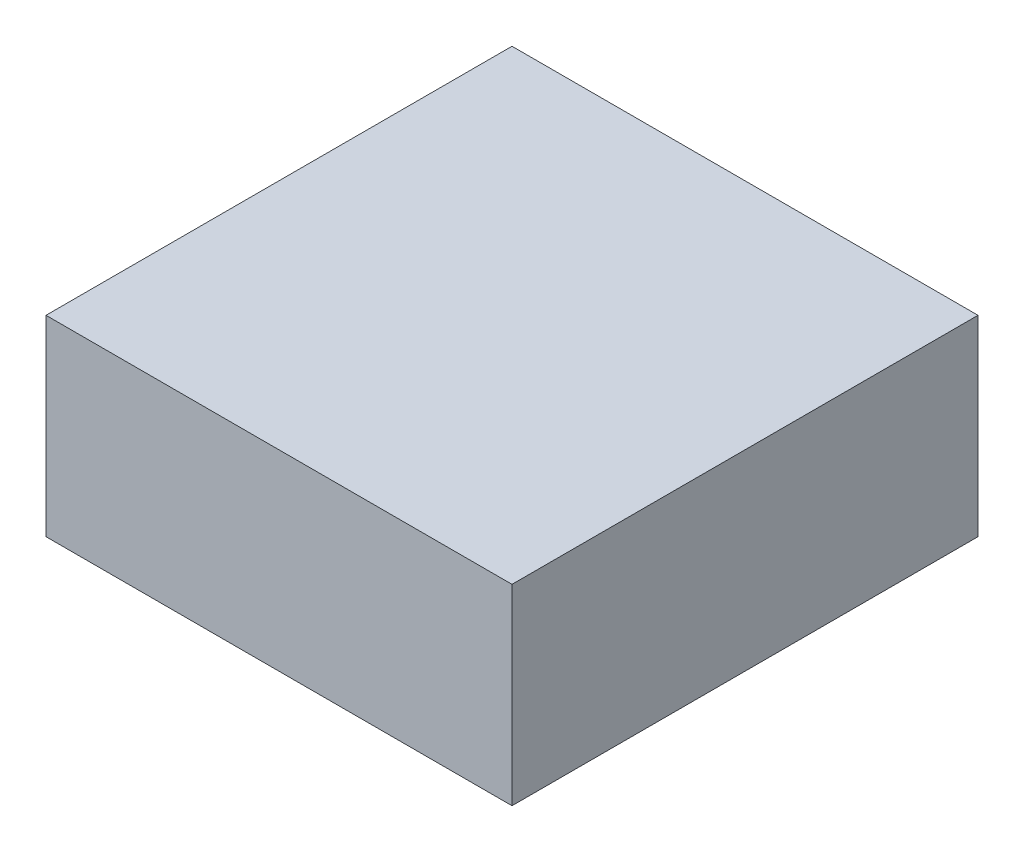
ISO-10303-21;
HEADER;
FILE_DESCRIPTION(('STEP AP214'),'2;1');
FILE_NAME('part.step','',(''),(''),'','','');
FILE_SCHEMA(('AUTOMOTIVE_DESIGN { 1 0 10303 214 1 1 1 1 }'));
ENDSEC;
DATA;
#1=APPLICATION_CONTEXT('core data for automotive mechanical design processes');
#2=APPLICATION_PROTOCOL_DEFINITION('international standard','automotive_design',2000,#1);
#3=PRODUCT_CONTEXT('',#1,'mechanical');
#4=PRODUCT('Part','Part','',(#3));
#5=PRODUCT_RELATED_PRODUCT_CATEGORY('part','',(#4));
#6=PRODUCT_DEFINITION_FORMATION('','',#4);
#7=PRODUCT_DEFINITION_CONTEXT('part definition',#1,'design');
#8=PRODUCT_DEFINITION('design','',#6,#7);
#9=PRODUCT_DEFINITION_SHAPE('','',#8);
#10=(LENGTH_UNIT() NAMED_UNIT(*) SI_UNIT(.MILLI.,.METRE.));
#11=(NAMED_UNIT(*) PLANE_ANGLE_UNIT() SI_UNIT($,.RADIAN.));
#12=(NAMED_UNIT(*) SI_UNIT($,.STERADIAN.) SOLID_ANGLE_UNIT());
#13=UNCERTAINTY_MEASURE_WITH_UNIT(LENGTH_MEASURE(1.E-05),#10,'distance_accuracy_value','');
#14=(GEOMETRIC_REPRESENTATION_CONTEXT(3) GLOBAL_UNCERTAINTY_ASSIGNED_CONTEXT((#13)) GLOBAL_UNIT_ASSIGNED_CONTEXT((#10,
#11,#12)) REPRESENTATION_CONTEXT('',''));
#15=CARTESIAN_POINT('',(0.,0.,0.));
#16=DIRECTION('',(0.,0.,1.));
#17=DIRECTION('',(1.,0.,0.));
#18=AXIS2_PLACEMENT_3D('',#15,#16,#17);
#19=CARTESIAN_POINT('',(0.,0.465,0.));
#20=DIRECTION('',(1.,0.,0.));
#21=DIRECTION('',(0.,0.,-1.));
#22=AXIS2_PLACEMENT_3D('',#19,#20,#21);
#23=PLANE('',#22);
#24=DIRECTION('',(0.,0.,1.));
#25=VECTOR('',#24,1.);
#26=CARTESIAN_POINT('',(0.,0.,0.));
#27=LINE('',#26,#25);
#28=CARTESIAN_POINT('',(0.,0.,0.));
#29=VERTEX_POINT('',#28);
#30=CARTESIAN_POINT('',(0.,0.,1.13));
#31=VERTEX_POINT('',#30);
#32=EDGE_CURVE('E98',#29,#31,#27,.T.);
#33=ORIENTED_EDGE('',*,*,#32,.T.);
#34=DIRECTION('',(0.,-1.,0.));
#35=VECTOR('',#34,1.);
#36=CARTESIAN_POINT('',(0.,0.465,1.13));
#37=LINE('',#36,#35);
#38=CARTESIAN_POINT('',(0.,0.465,1.13));
#39=VERTEX_POINT('',#38);
#40=EDGE_CURVE('E11',#39,#31,#37,.T.);
#41=ORIENTED_EDGE('',*,*,#40,.F.);
#42=DIRECTION('',(0.,0.,1.));
#43=VECTOR('',#42,1.);
#44=CARTESIAN_POINT('',(0.,0.465,0.));
#45=LINE('',#44,#43);
#46=CARTESIAN_POINT('',(0.,0.465,0.));
#47=VERTEX_POINT('',#46);
#48=EDGE_CURVE('E86',#47,#39,#45,.T.);
#49=ORIENTED_EDGE('',*,*,#48,.F.);
#50=DIRECTION('',(0.,-1.,0.));
#51=VECTOR('',#50,1.);
#52=CARTESIAN_POINT('',(0.,0.465,0.));
#53=LINE('',#52,#51);
#54=EDGE_CURVE('E94',#47,#29,#53,.T.);
#55=ORIENTED_EDGE('',*,*,#54,.T.);
#56=EDGE_LOOP('',(#33,#41,#49,#55));
#57=FACE_BOUND('',#56,.T.);
#58=ADVANCED_FACE('F35',(#57),#23,.F.);
#59=CARTESIAN_POINT('',(0.,0.465,1.13));
#60=DIRECTION('',(0.,0.,-1.));
#61=DIRECTION('',(-1.,0.,0.));
#62=AXIS2_PLACEMENT_3D('',#59,#60,#61);
#63=PLANE('',#62);
#64=DIRECTION('',(1.,0.,0.));
#65=VECTOR('',#64,1.);
#66=CARTESIAN_POINT('',(0.,0.,1.13));
#67=LINE('',#66,#65);
#68=CARTESIAN_POINT('',(1.13,0.,1.13));
#69=VERTEX_POINT('',#68);
#70=EDGE_CURVE('E90',#31,#69,#67,.T.);
#71=ORIENTED_EDGE('',*,*,#70,.T.);
#72=DIRECTION('',(0.,-1.,0.));
#73=VECTOR('',#72,1.);
#74=CARTESIAN_POINT('',(1.13,0.465,1.13));
#75=LINE('',#74,#73);
#76=CARTESIAN_POINT('',(1.13,0.465,1.13));
#77=VERTEX_POINT('',#76);
#78=EDGE_CURVE('E43',#77,#69,#75,.T.);
#79=ORIENTED_EDGE('',*,*,#78,.F.);
#80=DIRECTION('',(1.,0.,0.));
#81=VECTOR('',#80,1.);
#82=CARTESIAN_POINT('',(0.,0.465,1.13));
#83=LINE('',#82,#81);
#84=EDGE_CURVE('E81',#39,#77,#83,.T.);
#85=ORIENTED_EDGE('',*,*,#84,.F.);
#86=ORIENTED_EDGE('',*,*,#40,.T.);
#87=EDGE_LOOP('',(#71,#79,#85,#86));
#88=FACE_BOUND('',#87,.T.);
#89=ADVANCED_FACE('F89',(#88),#63,.F.);
#90=CARTESIAN_POINT('',(1.13,0.465,0.));
#91=DIRECTION('',(-1.,0.,0.));
#92=DIRECTION('',(0.,0.,1.));
#93=AXIS2_PLACEMENT_3D('',#90,#91,#92);
#94=PLANE('',#93);
#95=DIRECTION('',(0.,0.,-1.));
#96=VECTOR('',#95,1.);
#97=CARTESIAN_POINT('',(1.13,0.,0.));
#98=LINE('',#97,#96);
#99=CARTESIAN_POINT('',(1.13,0.,0.));
#100=VERTEX_POINT('',#99);
#101=EDGE_CURVE('E68',#69,#100,#98,.T.);
#102=ORIENTED_EDGE('',*,*,#101,.T.);
#103=DIRECTION('',(0.,-1.,0.));
#104=VECTOR('',#103,1.);
#105=CARTESIAN_POINT('',(1.13,0.465,0.));
#106=LINE('',#105,#104);
#107=CARTESIAN_POINT('',(1.13,0.465,0.));
#108=VERTEX_POINT('',#107);
#109=EDGE_CURVE('E91',#108,#100,#106,.T.);
#110=ORIENTED_EDGE('',*,*,#109,.F.);
#111=DIRECTION('',(0.,0.,-1.));
#112=VECTOR('',#111,1.);
#113=CARTESIAN_POINT('',(1.13,0.465,0.));
#114=LINE('',#113,#112);
#115=EDGE_CURVE('E84',#77,#108,#114,.T.);
#116=ORIENTED_EDGE('',*,*,#115,.F.);
#117=ORIENTED_EDGE('',*,*,#78,.T.);
#118=EDGE_LOOP('',(#102,#110,#116,#117));
#119=FACE_BOUND('',#118,.T.);
#120=ADVANCED_FACE('F92',(#119),#94,.F.);
#121=CARTESIAN_POINT('',(0.,0.465,0.));
#122=DIRECTION('',(0.,0.,1.));
#123=DIRECTION('',(1.,0.,0.));
#124=AXIS2_PLACEMENT_3D('',#121,#122,#123);
#125=PLANE('',#124);
#126=DIRECTION('',(-1.,0.,0.));
#127=VECTOR('',#126,1.);
#128=CARTESIAN_POINT('',(0.,0.,0.));
#129=LINE('',#128,#127);
#130=EDGE_CURVE('E74',#100,#29,#129,.T.);
#131=ORIENTED_EDGE('',*,*,#130,.T.);
#132=ORIENTED_EDGE('',*,*,#54,.F.);
#133=DIRECTION('',(-1.,0.,0.));
#134=VECTOR('',#133,1.);
#135=CARTESIAN_POINT('',(0.,0.465,0.));
#136=LINE('',#135,#134);
#137=EDGE_CURVE('E51',#108,#47,#136,.T.);
#138=ORIENTED_EDGE('',*,*,#137,.F.);
#139=ORIENTED_EDGE('',*,*,#109,.T.);
#140=EDGE_LOOP('',(#131,#132,#138,#139));
#141=FACE_BOUND('',#140,.T.);
#142=ADVANCED_FACE('F105',(#141),#125,.F.);
#143=CARTESIAN_POINT('',(0.,0.465,0.));
#144=DIRECTION('',(0.,1.,0.));
#145=DIRECTION('',(0.,0.,1.));
#146=AXIS2_PLACEMENT_3D('',#143,#144,#145);
#147=PLANE('',#146);
#148=ORIENTED_EDGE('',*,*,#48,.T.);
#149=ORIENTED_EDGE('',*,*,#84,.T.);
#150=ORIENTED_EDGE('',*,*,#115,.T.);
#151=ORIENTED_EDGE('',*,*,#137,.T.);
#152=EDGE_LOOP('',(#148,#149,#150,#151));
#153=FACE_BOUND('',#152,.T.);
#154=ADVANCED_FACE('F82',(#153),#147,.T.);
#155=CARTESIAN_POINT('',(0.,0.,0.));
#156=DIRECTION('',(0.,1.,0.));
#157=DIRECTION('',(0.,0.,1.));
#158=AXIS2_PLACEMENT_3D('',#155,#156,#157);
#159=PLANE('',#158);
#160=ORIENTED_EDGE('',*,*,#32,.F.);
#161=ORIENTED_EDGE('',*,*,#130,.F.);
#162=ORIENTED_EDGE('',*,*,#101,.F.);
#163=ORIENTED_EDGE('',*,*,#70,.F.);
#164=EDGE_LOOP('',(#160,#161,#162,#163));
#165=FACE_BOUND('',#164,.T.);
#166=ADVANCED_FACE('F108',(#165),#159,.F.);
#167=CLOSED_SHELL('',(#58,#89,#120,#142,#154,#166));
#168=MANIFOLD_SOLID_BREP('B2',#167);
#169=ADVANCED_BREP_SHAPE_REPRESENTATION('',(#18,#168),#14);
#170=SHAPE_DEFINITION_REPRESENTATION(#9,#169);
ENDSEC;
END-ISO-10303-21;
